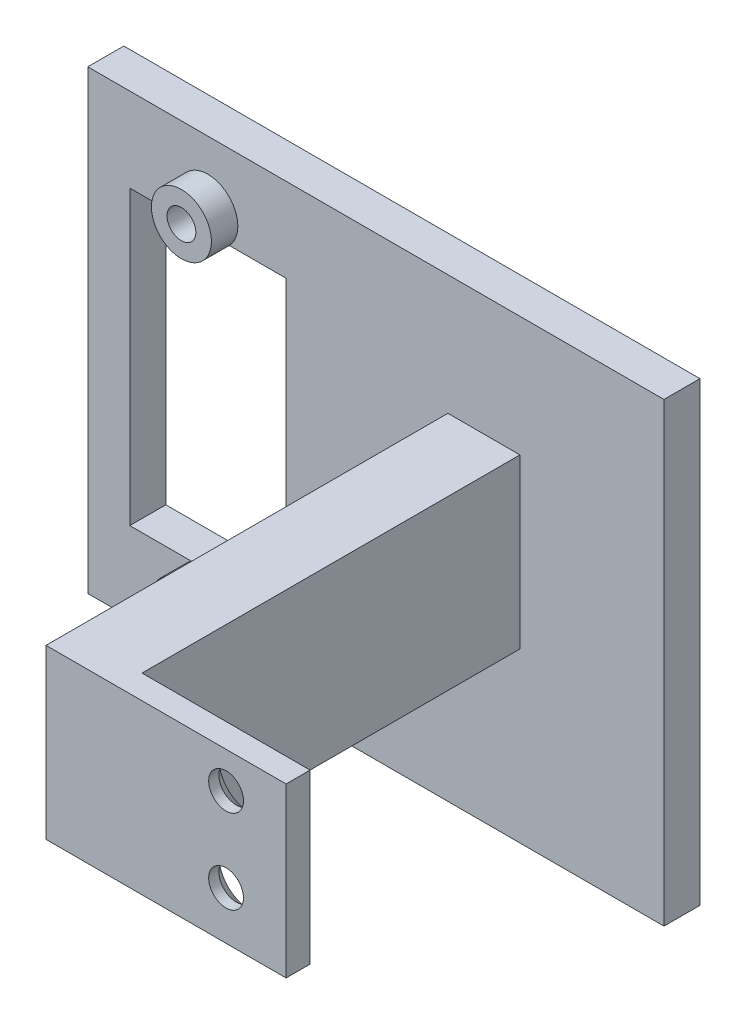
ISO-10303-21;
HEADER;
FILE_DESCRIPTION(('STEP AP214'),'2;1');
FILE_NAME('part.step','',(''),(''),'','','');
FILE_SCHEMA(('AUTOMOTIVE_DESIGN { 1 0 10303 214 1 1 1 1 }'));
ENDSEC;
DATA;
#1=APPLICATION_CONTEXT('core data for automotive mechanical design processes');
#2=APPLICATION_PROTOCOL_DEFINITION('international standard','automotive_design',2000,#1);
#3=PRODUCT_CONTEXT('',#1,'mechanical');
#4=PRODUCT('Part','Part','',(#3));
#5=PRODUCT_RELATED_PRODUCT_CATEGORY('part','',(#4));
#6=PRODUCT_DEFINITION_FORMATION('','',#4);
#7=PRODUCT_DEFINITION_CONTEXT('part definition',#1,'design');
#8=PRODUCT_DEFINITION('design','',#6,#7);
#9=PRODUCT_DEFINITION_SHAPE('','',#8);
#10=(LENGTH_UNIT() NAMED_UNIT(*) SI_UNIT(.MILLI.,.METRE.));
#11=(NAMED_UNIT(*) PLANE_ANGLE_UNIT() SI_UNIT($,.RADIAN.));
#12=(NAMED_UNIT(*) SI_UNIT($,.STERADIAN.) SOLID_ANGLE_UNIT());
#13=UNCERTAINTY_MEASURE_WITH_UNIT(LENGTH_MEASURE(1.E-05),#10,'distance_accuracy_value','');
#14=(GEOMETRIC_REPRESENTATION_CONTEXT(3) GLOBAL_UNCERTAINTY_ASSIGNED_CONTEXT((#13)) GLOBAL_UNIT_ASSIGNED_CONTEXT((#10,
#11,#12)) REPRESENTATION_CONTEXT('',''));
#15=CARTESIAN_POINT('',(0.,0.,0.));
#16=DIRECTION('',(0.,0.,1.));
#17=DIRECTION('',(1.,0.,0.));
#18=AXIS2_PLACEMENT_3D('',#15,#16,#17);
#19=CARTESIAN_POINT('',(-25.,25.,0.01));
#20=DIRECTION('',(0.,0.,-1.));
#21=DIRECTION('',(-1.,0.,0.));
#22=AXIS2_PLACEMENT_3D('',#19,#20,#21);
#23=CYLINDRICAL_SURFACE('',#22,1.45);
#24=CARTESIAN_POINT('',(-25.,25.,0.));
#25=DIRECTION('',(0.,0.,-1.));
#26=DIRECTION('',(-1.,0.,0.));
#27=AXIS2_PLACEMENT_3D('',#24,#25,#26);
#28=CIRCLE('',#27,1.45);
#29=CARTESIAN_POINT('',(-26.45,25.,0.));
#30=VERTEX_POINT('',#29);
#31=EDGE_CURVE('E192',#30,#30,#28,.T.);
#32=ORIENTED_EDGE('',*,*,#31,.F.);
#33=EDGE_LOOP('',(#32));
#34=FACE_BOUND('',#33,.T.);
#35=CARTESIAN_POINT('',(-25.,25.,-0.85));
#36=DIRECTION('',(0.,0.,-1.));
#37=DIRECTION('',(-1.,0.,0.));
#38=AXIS2_PLACEMENT_3D('',#35,#36,#37);
#39=CIRCLE('',#38,1.45);
#40=CARTESIAN_POINT('',(-26.45,25.,-0.85));
#41=VERTEX_POINT('',#40);
#42=EDGE_CURVE('E194',#41,#41,#39,.T.);
#43=ORIENTED_EDGE('',*,*,#42,.T.);
#44=EDGE_LOOP('',(#43));
#45=FACE_BOUND('',#44,.T.);
#46=ADVANCED_FACE('F41',(#34,#45),#23,.F.);
#47=CARTESIAN_POINT('',(-25.,18.,0.01));
#48=DIRECTION('',(0.,0.,-1.));
#49=DIRECTION('',(-1.,0.,0.));
#50=AXIS2_PLACEMENT_3D('',#47,#48,#49);
#51=CYLINDRICAL_SURFACE('',#50,1.45);
#52=CARTESIAN_POINT('',(-25.,18.,0.));
#53=DIRECTION('',(0.,0.,-1.));
#54=DIRECTION('',(-1.,0.,0.));
#55=AXIS2_PLACEMENT_3D('',#52,#53,#54);
#56=CIRCLE('',#55,1.45);
#57=CARTESIAN_POINT('',(-26.45,18.,0.));
#58=VERTEX_POINT('',#57);
#59=EDGE_CURVE('E44',#58,#58,#56,.T.);
#60=ORIENTED_EDGE('',*,*,#59,.F.);
#61=EDGE_LOOP('',(#60));
#62=FACE_BOUND('',#61,.T.);
#63=CARTESIAN_POINT('',(-25.,18.,-0.85));
#64=DIRECTION('',(0.,0.,-1.));
#65=DIRECTION('',(-1.,0.,0.));
#66=AXIS2_PLACEMENT_3D('',#63,#64,#65);
#67=CIRCLE('',#66,1.45);
#68=CARTESIAN_POINT('',(-26.45,18.,-0.85));
#69=VERTEX_POINT('',#68);
#70=EDGE_CURVE('E187',#69,#69,#67,.T.);
#71=ORIENTED_EDGE('',*,*,#70,.T.);
#72=EDGE_LOOP('',(#71));
#73=FACE_BOUND('',#72,.T.);
#74=ADVANCED_FACE('F306',(#62,#73),#51,.F.);
#75=CARTESIAN_POINT('',(0.,0.,-33.480025));
#76=DIRECTION('',(0.,0.,-1.));
#77=DIRECTION('',(-1.,0.,0.));
#78=AXIS2_PLACEMENT_3D('',#75,#76,#77);
#79=PLANE('',#78);
#80=CARTESIAN_POINT('',(-60.,4.55,-33.480025));
#81=DIRECTION('',(0.,0.,1.));
#82=DIRECTION('',(1.,0.,0.));
#83=AXIS2_PLACEMENT_3D('',#80,#81,#82);
#84=CIRCLE('',#83,2.5);
#85=CARTESIAN_POINT('',(-61.3564659966251,6.65,-33.480025));
#86=VERTEX_POINT('',#85);
#87=CARTESIAN_POINT('',(-58.6435340033749,6.65,-33.480025));
#88=VERTEX_POINT('',#87);
#89=EDGE_CURVE('E59',#86,#88,#84,.T.);
#90=ORIENTED_EDGE('',*,*,#89,.F.);
#91=DIRECTION('',(1.,0.,0.));
#92=VECTOR('',#91,1.);
#93=CARTESIAN_POINT('',(-66.5,6.65,-33.480025));
#94=LINE('',#93,#92);
#95=CARTESIAN_POINT('',(-66.5,6.65,-33.480025));
#96=VERTEX_POINT('',#95);
#97=EDGE_CURVE('E236',#96,#86,#94,.T.);
#98=ORIENTED_EDGE('',*,*,#97,.F.);
#99=DIRECTION('',(0.,-1.,0.));
#100=VECTOR('',#99,1.);
#101=CARTESIAN_POINT('',(-66.5,6.65,-33.480025));
#102=LINE('',#101,#100);
#103=CARTESIAN_POINT('',(-66.5,31.,-33.480025));
#104=VERTEX_POINT('',#103);
#105=EDGE_CURVE('E174',#104,#96,#102,.T.);
#106=ORIENTED_EDGE('',*,*,#105,.F.);
#107=DIRECTION('',(-1.,0.,0.));
#108=VECTOR('',#107,1.);
#109=CARTESIAN_POINT('',(-66.5,31.,-33.480025));
#110=LINE('',#109,#108);
#111=CARTESIAN_POINT('',(-61.7853571071357,31.,-33.480025));
#112=VERTEX_POINT('',#111);
#113=EDGE_CURVE('E162',#112,#104,#110,.T.);
#114=ORIENTED_EDGE('',*,*,#113,.F.);
#115=CARTESIAN_POINT('',(-60.,32.75,-33.480025));
#116=DIRECTION('',(0.,0.,1.));
#117=DIRECTION('',(1.,0.,0.));
#118=AXIS2_PLACEMENT_3D('',#115,#116,#117);
#119=CIRCLE('',#118,2.5);
#120=CARTESIAN_POINT('',(-58.2146428928643,31.,-33.480025));
#121=VERTEX_POINT('',#120);
#122=EDGE_CURVE('E65',#121,#112,#119,.T.);
#123=ORIENTED_EDGE('',*,*,#122,.F.);
#124=CARTESIAN_POINT('',(-53.5,31.,-33.480025));
#125=VERTEX_POINT('',#124);
#126=EDGE_CURVE('E163',#125,#121,#110,.T.);
#127=ORIENTED_EDGE('',*,*,#126,.F.);
#128=DIRECTION('',(0.,1.,0.));
#129=VECTOR('',#128,1.);
#130=CARTESIAN_POINT('',(-53.5,6.65,-33.480025));
#131=LINE('',#130,#129);
#132=CARTESIAN_POINT('',(-53.5,6.65,-33.480025));
#133=VERTEX_POINT('',#132);
#134=EDGE_CURVE('E172',#133,#125,#131,.T.);
#135=ORIENTED_EDGE('',*,*,#134,.F.);
#136=EDGE_CURVE('E234',#88,#133,#94,.T.);
#137=ORIENTED_EDGE('',*,*,#136,.F.);
#138=EDGE_LOOP('',(#90,#98,#106,#114,#123,#127,#135,#137));
#139=FACE_BOUND('',#138,.T.);
#140=DIRECTION('',(0.,-1.,0.));
#141=VECTOR('',#140,1.);
#142=CARTESIAN_POINT('',(-70.,0.,-33.480025));
#143=LINE('',#142,#141);
#144=CARTESIAN_POINT('',(-70.,38.,-33.480025));
#145=VERTEX_POINT('',#144);
#146=CARTESIAN_POINT('',(-70.,0.,-33.480025));
#147=VERTEX_POINT('',#146);
#148=EDGE_CURVE('E263',#145,#147,#143,.T.);
#149=ORIENTED_EDGE('',*,*,#148,.T.);
#150=DIRECTION('',(1.,0.,0.));
#151=VECTOR('',#150,1.);
#152=CARTESIAN_POINT('',(-70.,0.,-33.480025));
#153=LINE('',#152,#151);
#154=CARTESIAN_POINT('',(-22.,0.,-33.480025));
#155=VERTEX_POINT('',#154);
#156=EDGE_CURVE('E264',#147,#155,#153,.T.);
#157=ORIENTED_EDGE('',*,*,#156,.T.);
#158=DIRECTION('',(0.,1.,0.));
#159=VECTOR('',#158,1.);
#160=CARTESIAN_POINT('',(-22.,0.,-33.480025));
#161=LINE('',#160,#159);
#162=CARTESIAN_POINT('',(-22.,38.,-33.480025));
#163=VERTEX_POINT('',#162);
#164=EDGE_CURVE('E270',#155,#163,#161,.T.);
#165=ORIENTED_EDGE('',*,*,#164,.T.);
#166=DIRECTION('',(-1.,0.,0.));
#167=VECTOR('',#166,1.);
#168=CARTESIAN_POINT('',(-70.,38.,-33.480025));
#169=LINE('',#168,#167);
#170=EDGE_CURVE('E267',#163,#145,#169,.T.);
#171=ORIENTED_EDGE('',*,*,#170,.T.);
#172=EDGE_LOOP('',(#149,#157,#165,#171));
#173=FACE_BOUND('',#172,.T.);
#174=DIRECTION('',(0.,-1.,0.));
#175=VECTOR('',#174,1.);
#176=CARTESIAN_POINT('',(-40.,0.,-33.480025));
#177=LINE('',#176,#175);
#178=CARTESIAN_POINT('',(-40.,28.,-33.480025));
#179=VERTEX_POINT('',#178);
#180=CARTESIAN_POINT('',(-40.,14.,-33.480025));
#181=VERTEX_POINT('',#180);
#182=EDGE_CURVE('E49',#179,#181,#177,.T.);
#183=ORIENTED_EDGE('',*,*,#182,.F.);
#184=DIRECTION('',(-1.,0.,0.));
#185=VECTOR('',#184,1.);
#186=CARTESIAN_POINT('',(0.,28.,-33.480025));
#187=LINE('',#186,#185);
#188=CARTESIAN_POINT('',(-34.,28.,-33.480025));
#189=VERTEX_POINT('',#188);
#190=EDGE_CURVE('E290',#189,#179,#187,.T.);
#191=ORIENTED_EDGE('',*,*,#190,.F.);
#192=DIRECTION('',(0.,1.,0.));
#193=VECTOR('',#192,1.);
#194=CARTESIAN_POINT('',(-34.,0.,-33.480025));
#195=LINE('',#194,#193);
#196=CARTESIAN_POINT('',(-34.,14.,-33.480025));
#197=VERTEX_POINT('',#196);
#198=EDGE_CURVE('E295',#197,#189,#195,.T.);
#199=ORIENTED_EDGE('',*,*,#198,.F.);
#200=DIRECTION('',(1.,0.,0.));
#201=VECTOR('',#200,1.);
#202=CARTESIAN_POINT('',(0.,14.,-33.480025));
#203=LINE('',#202,#201);
#204=EDGE_CURVE('E298',#181,#197,#203,.T.);
#205=ORIENTED_EDGE('',*,*,#204,.F.);
#206=EDGE_LOOP('',(#183,#191,#199,#205));
#207=FACE_BOUND('',#206,.T.);
#208=ADVANCED_FACE('F167',(#139,#173,#207),#79,.F.);
#209=CARTESIAN_POINT('',(0.,0.,-36.480025));
#210=DIRECTION('',(0.,0.,-1.));
#211=DIRECTION('',(-1.,0.,0.));
#212=AXIS2_PLACEMENT_3D('',#209,#210,#211);
#213=PLANE('',#212);
#214=CARTESIAN_POINT('',(-60.,4.55,-36.480025));
#215=DIRECTION('',(0.,0.,-1.));
#216=DIRECTION('',(-1.,0.,0.));
#217=AXIS2_PLACEMENT_3D('',#214,#215,#216);
#218=CIRCLE('',#217,1.2);
#219=CARTESIAN_POINT('',(-61.2,4.55,-36.480025));
#220=VERTEX_POINT('',#219);
#221=EDGE_CURVE('E404',#220,#220,#218,.T.);
#222=ORIENTED_EDGE('',*,*,#221,.F.);
#223=EDGE_LOOP('',(#222));
#224=FACE_BOUND('',#223,.T.);
#225=CARTESIAN_POINT('',(-60.,32.75,-36.480025));
#226=DIRECTION('',(0.,0.,-1.));
#227=DIRECTION('',(-1.,0.,0.));
#228=AXIS2_PLACEMENT_3D('',#225,#226,#227);
#229=CIRCLE('',#228,1.2);
#230=CARTESIAN_POINT('',(-61.2,32.75,-36.480025));
#231=VERTEX_POINT('',#230);
#232=EDGE_CURVE('E188',#231,#231,#229,.T.);
#233=ORIENTED_EDGE('',*,*,#232,.F.);
#234=EDGE_LOOP('',(#233));
#235=FACE_BOUND('',#234,.T.);
#236=DIRECTION('',(0.,-1.,0.));
#237=VECTOR('',#236,1.);
#238=CARTESIAN_POINT('',(-70.,0.,-36.480025));
#239=LINE('',#238,#237);
#240=CARTESIAN_POINT('',(-70.,38.,-36.480025));
#241=VERTEX_POINT('',#240);
#242=CARTESIAN_POINT('',(-70.,0.,-36.480025));
#243=VERTEX_POINT('',#242);
#244=EDGE_CURVE('E259',#241,#243,#239,.T.);
#245=ORIENTED_EDGE('',*,*,#244,.F.);
#246=DIRECTION('',(-1.,0.,0.));
#247=VECTOR('',#246,1.);
#248=CARTESIAN_POINT('',(-70.,38.,-36.480025));
#249=LINE('',#248,#247);
#250=CARTESIAN_POINT('',(-22.,38.,-36.480025));
#251=VERTEX_POINT('',#250);
#252=EDGE_CURVE('E262',#251,#241,#249,.T.);
#253=ORIENTED_EDGE('',*,*,#252,.F.);
#254=DIRECTION('',(0.,1.,0.));
#255=VECTOR('',#254,1.);
#256=CARTESIAN_POINT('',(-22.,0.,-36.480025));
#257=LINE('',#256,#255);
#258=CARTESIAN_POINT('',(-22.,0.,-36.480025));
#259=VERTEX_POINT('',#258);
#260=EDGE_CURVE('E276',#259,#251,#257,.T.);
#261=ORIENTED_EDGE('',*,*,#260,.F.);
#262=DIRECTION('',(1.,0.,0.));
#263=VECTOR('',#262,1.);
#264=CARTESIAN_POINT('',(-70.,0.,-36.480025));
#265=LINE('',#264,#263);
#266=EDGE_CURVE('E272',#243,#259,#265,.T.);
#267=ORIENTED_EDGE('',*,*,#266,.F.);
#268=EDGE_LOOP('',(#245,#253,#261,#267));
#269=FACE_BOUND('',#268,.T.);
#270=DIRECTION('',(-1.,0.,0.));
#271=VECTOR('',#270,1.);
#272=CARTESIAN_POINT('',(-66.5,31.,-36.480025));
#273=LINE('',#272,#271);
#274=CARTESIAN_POINT('',(-53.5,31.,-36.480025));
#275=VERTEX_POINT('',#274);
#276=CARTESIAN_POINT('',(-66.5,31.,-36.480025));
#277=VERTEX_POINT('',#276);
#278=EDGE_CURVE('E233',#275,#277,#273,.T.);
#279=ORIENTED_EDGE('',*,*,#278,.T.);
#280=DIRECTION('',(0.,-1.,0.));
#281=VECTOR('',#280,1.);
#282=CARTESIAN_POINT('',(-66.5,6.65,-36.480025));
#283=LINE('',#282,#281);
#284=CARTESIAN_POINT('',(-66.5,6.65,-36.480025));
#285=VERTEX_POINT('',#284);
#286=EDGE_CURVE('E235',#277,#285,#283,.T.);
#287=ORIENTED_EDGE('',*,*,#286,.T.);
#288=DIRECTION('',(1.,0.,0.));
#289=VECTOR('',#288,1.);
#290=CARTESIAN_POINT('',(-66.5,6.65,-36.480025));
#291=LINE('',#290,#289);
#292=CARTESIAN_POINT('',(-53.5,6.65,-36.480025));
#293=VERTEX_POINT('',#292);
#294=EDGE_CURVE('E243',#285,#293,#291,.T.);
#295=ORIENTED_EDGE('',*,*,#294,.T.);
#296=DIRECTION('',(0.,1.,0.));
#297=VECTOR('',#296,1.);
#298=CARTESIAN_POINT('',(-53.5,6.65,-36.480025));
#299=LINE('',#298,#297);
#300=EDGE_CURVE('E249',#293,#275,#299,.T.);
#301=ORIENTED_EDGE('',*,*,#300,.T.);
#302=EDGE_LOOP('',(#279,#287,#295,#301));
#303=FACE_BOUND('',#302,.T.);
#304=ADVANCED_FACE('F429',(#224,#235,#269,#303),#213,.T.);
#305=CARTESIAN_POINT('',(-70.,0.,-33.480025));
#306=DIRECTION('',(1.,0.,0.));
#307=DIRECTION('',(0.,0.,-1.));
#308=AXIS2_PLACEMENT_3D('',#305,#306,#307);
#309=PLANE('',#308);
#310=ORIENTED_EDGE('',*,*,#244,.T.);
#311=DIRECTION('',(0.,0.,-1.));
#312=VECTOR('',#311,1.);
#313=CARTESIAN_POINT('',(-70.,0.,-33.480025));
#314=LINE('',#313,#312);
#315=EDGE_CURVE('E287',#147,#243,#314,.T.);
#316=ORIENTED_EDGE('',*,*,#315,.F.);
#317=ORIENTED_EDGE('',*,*,#148,.F.);
#318=DIRECTION('',(0.,0.,-1.));
#319=VECTOR('',#318,1.);
#320=CARTESIAN_POINT('',(-70.,38.,-33.480025));
#321=LINE('',#320,#319);
#322=EDGE_CURVE('E271',#145,#241,#321,.T.);
#323=ORIENTED_EDGE('',*,*,#322,.T.);
#324=EDGE_LOOP('',(#310,#316,#317,#323));
#325=FACE_BOUND('',#324,.T.);
#326=ADVANCED_FACE('F43',(#325),#309,.F.);
#327=CARTESIAN_POINT('',(-70.,0.,-33.480025));
#328=DIRECTION('',(0.,1.,0.));
#329=DIRECTION('',(0.,0.,1.));
#330=AXIS2_PLACEMENT_3D('',#327,#328,#329);
#331=PLANE('',#330);
#332=ORIENTED_EDGE('',*,*,#266,.T.);
#333=DIRECTION('',(0.,0.,-1.));
#334=VECTOR('',#333,1.);
#335=CARTESIAN_POINT('',(-22.,0.,-33.480025));
#336=LINE('',#335,#334);
#337=EDGE_CURVE('E281',#155,#259,#336,.T.);
#338=ORIENTED_EDGE('',*,*,#337,.F.);
#339=ORIENTED_EDGE('',*,*,#156,.F.);
#340=ORIENTED_EDGE('',*,*,#315,.T.);
#341=EDGE_LOOP('',(#332,#338,#339,#340));
#342=FACE_BOUND('',#341,.T.);
#343=ADVANCED_FACE('F454',(#342),#331,.F.);
#344=CARTESIAN_POINT('',(-22.,0.,-33.480025));
#345=DIRECTION('',(-1.,0.,0.));
#346=DIRECTION('',(0.,0.,1.));
#347=AXIS2_PLACEMENT_3D('',#344,#345,#346);
#348=PLANE('',#347);
#349=ORIENTED_EDGE('',*,*,#260,.T.);
#350=DIRECTION('',(0.,0.,-1.));
#351=VECTOR('',#350,1.);
#352=CARTESIAN_POINT('',(-22.,38.,-33.480025));
#353=LINE('',#352,#351);
#354=EDGE_CURVE('E282',#163,#251,#353,.T.);
#355=ORIENTED_EDGE('',*,*,#354,.F.);
#356=ORIENTED_EDGE('',*,*,#164,.F.);
#357=ORIENTED_EDGE('',*,*,#337,.T.);
#358=EDGE_LOOP('',(#349,#355,#356,#357));
#359=FACE_BOUND('',#358,.T.);
#360=ADVANCED_FACE('F445',(#359),#348,.F.);
#361=CARTESIAN_POINT('',(-70.,38.,-33.480025));
#362=DIRECTION('',(0.,-1.,0.));
#363=DIRECTION('',(0.,0.,-1.));
#364=AXIS2_PLACEMENT_3D('',#361,#362,#363);
#365=PLANE('',#364);
#366=ORIENTED_EDGE('',*,*,#252,.T.);
#367=ORIENTED_EDGE('',*,*,#322,.F.);
#368=ORIENTED_EDGE('',*,*,#170,.F.);
#369=ORIENTED_EDGE('',*,*,#354,.T.);
#370=EDGE_LOOP('',(#366,#367,#368,#369));
#371=FACE_BOUND('',#370,.T.);
#372=ADVANCED_FACE('F433',(#371),#365,.F.);
#373=CARTESIAN_POINT('',(-66.5,6.65,-33.480025));
#374=DIRECTION('',(1.,0.,0.));
#375=DIRECTION('',(0.,0.,-1.));
#376=AXIS2_PLACEMENT_3D('',#373,#374,#375);
#377=PLANE('',#376);
#378=ORIENTED_EDGE('',*,*,#286,.F.);
#379=DIRECTION('',(0.,0.,-1.));
#380=VECTOR('',#379,1.);
#381=CARTESIAN_POINT('',(-66.5,31.,-33.480025));
#382=LINE('',#381,#380);
#383=EDGE_CURVE('E244',#104,#277,#382,.T.);
#384=ORIENTED_EDGE('',*,*,#383,.F.);
#385=ORIENTED_EDGE('',*,*,#105,.T.);
#386=DIRECTION('',(0.,0.,-1.));
#387=VECTOR('',#386,1.);
#388=CARTESIAN_POINT('',(-66.5,6.65,-33.480025));
#389=LINE('',#388,#387);
#390=EDGE_CURVE('E257',#96,#285,#389,.T.);
#391=ORIENTED_EDGE('',*,*,#390,.T.);
#392=EDGE_LOOP('',(#378,#384,#385,#391));
#393=FACE_BOUND('',#392,.T.);
#394=ADVANCED_FACE('F434',(#393),#377,.T.);
#395=CARTESIAN_POINT('',(-66.5,6.65,-33.480025));
#396=DIRECTION('',(0.,1.,0.));
#397=DIRECTION('',(0.,0.,1.));
#398=AXIS2_PLACEMENT_3D('',#395,#396,#397);
#399=PLANE('',#398);
#400=ORIENTED_EDGE('',*,*,#294,.F.);
#401=ORIENTED_EDGE('',*,*,#390,.F.);
#402=ORIENTED_EDGE('',*,*,#97,.T.);
#403=EDGE_CURVE('E239',#86,#88,#94,.T.);
#404=ORIENTED_EDGE('',*,*,#403,.T.);
#405=ORIENTED_EDGE('',*,*,#136,.T.);
#406=DIRECTION('',(0.,0.,-1.));
#407=VECTOR('',#406,1.);
#408=CARTESIAN_POINT('',(-53.5,6.65,-33.480025));
#409=LINE('',#408,#407);
#410=EDGE_CURVE('E251',#133,#293,#409,.T.);
#411=ORIENTED_EDGE('',*,*,#410,.T.);
#412=EDGE_LOOP('',(#400,#401,#402,#404,#405,#411));
#413=FACE_BOUND('',#412,.T.);
#414=ADVANCED_FACE('F422',(#413),#399,.T.);
#415=CARTESIAN_POINT('',(-53.5,6.65,-33.480025));
#416=DIRECTION('',(-1.,0.,0.));
#417=DIRECTION('',(0.,0.,1.));
#418=AXIS2_PLACEMENT_3D('',#415,#416,#417);
#419=PLANE('',#418);
#420=ORIENTED_EDGE('',*,*,#300,.F.);
#421=ORIENTED_EDGE('',*,*,#410,.F.);
#422=ORIENTED_EDGE('',*,*,#134,.T.);
#423=DIRECTION('',(0.,0.,-1.));
#424=VECTOR('',#423,1.);
#425=CARTESIAN_POINT('',(-53.5,31.,-33.480025));
#426=LINE('',#425,#424);
#427=EDGE_CURVE('E253',#125,#275,#426,.T.);
#428=ORIENTED_EDGE('',*,*,#427,.T.);
#429=EDGE_LOOP('',(#420,#421,#422,#428));
#430=FACE_BOUND('',#429,.T.);
#431=ADVANCED_FACE('F427',(#430),#419,.T.);
#432=CARTESIAN_POINT('',(-66.5,31.,-33.480025));
#433=DIRECTION('',(0.,-1.,0.));
#434=DIRECTION('',(0.,0.,-1.));
#435=AXIS2_PLACEMENT_3D('',#432,#433,#434);
#436=PLANE('',#435);
#437=ORIENTED_EDGE('',*,*,#278,.F.);
#438=ORIENTED_EDGE('',*,*,#427,.F.);
#439=ORIENTED_EDGE('',*,*,#126,.T.);
#440=EDGE_CURVE('E156',#121,#112,#110,.T.);
#441=ORIENTED_EDGE('',*,*,#440,.T.);
#442=ORIENTED_EDGE('',*,*,#113,.T.);
#443=ORIENTED_EDGE('',*,*,#383,.T.);
#444=EDGE_LOOP('',(#437,#438,#439,#441,#442,#443));
#445=FACE_BOUND('',#444,.T.);
#446=ADVANCED_FACE('F158',(#445),#436,.T.);
#447=CARTESIAN_POINT('',(-40.,14.,-1.));
#448=DIRECTION('',(1.,0.,0.));
#449=DIRECTION('',(0.,0.,-1.));
#450=AXIS2_PLACEMENT_3D('',#447,#448,#449);
#451=PLANE('',#450);
#452=DIRECTION('',(0.,0.,-1.));
#453=VECTOR('',#452,1.);
#454=CARTESIAN_POINT('',(-40.,28.,-1.));
#455=LINE('',#454,#453);
#456=CARTESIAN_POINT('',(-40.,28.,0.));
#457=VERTEX_POINT('',#456);
#458=EDGE_CURVE('E225',#457,#179,#455,.T.);
#459=ORIENTED_EDGE('',*,*,#458,.T.);
#460=ORIENTED_EDGE('',*,*,#182,.T.);
#461=DIRECTION('',(0.,0.,-1.));
#462=VECTOR('',#461,1.);
#463=CARTESIAN_POINT('',(-40.,14.,-1.));
#464=LINE('',#463,#462);
#465=CARTESIAN_POINT('',(-40.,14.,0.));
#466=VERTEX_POINT('',#465);
#467=EDGE_CURVE('E226',#466,#181,#464,.T.);
#468=ORIENTED_EDGE('',*,*,#467,.F.);
#469=DIRECTION('',(0.,-1.,0.));
#470=VECTOR('',#469,1.);
#471=CARTESIAN_POINT('',(-40.,14.,0.));
#472=LINE('',#471,#470);
#473=EDGE_CURVE('E201',#457,#466,#472,.T.);
#474=ORIENTED_EDGE('',*,*,#473,.F.);
#475=EDGE_LOOP('',(#459,#460,#468,#474));
#476=FACE_BOUND('',#475,.T.);
#477=ADVANCED_FACE('F347',(#476),#451,.F.);
#478=CARTESIAN_POINT('',(-40.,14.,-1.));
#479=DIRECTION('',(0.,1.,0.));
#480=DIRECTION('',(0.,0.,1.));
#481=AXIS2_PLACEMENT_3D('',#478,#479,#480);
#482=PLANE('',#481);
#483=DIRECTION('',(0.,0.,-1.));
#484=VECTOR('',#483,1.);
#485=CARTESIAN_POINT('',(-34.,14.,-1.));
#486=LINE('',#485,#484);
#487=CARTESIAN_POINT('',(-34.,14.,-2.));
#488=VERTEX_POINT('',#487);
#489=EDGE_CURVE('E228',#488,#197,#486,.T.);
#490=ORIENTED_EDGE('',*,*,#489,.F.);
#491=DIRECTION('',(1.,0.,0.));
#492=VECTOR('',#491,1.);
#493=CARTESIAN_POINT('',(-40.,14.,-2.));
#494=LINE('',#493,#492);
#495=CARTESIAN_POINT('',(-20.,14.,-2.));
#496=VERTEX_POINT('',#495);
#497=EDGE_CURVE('E214',#488,#496,#494,.T.);
#498=ORIENTED_EDGE('',*,*,#497,.T.);
#499=DIRECTION('',(0.,0.,-1.));
#500=VECTOR('',#499,1.);
#501=CARTESIAN_POINT('',(-20.,14.,0.));
#502=LINE('',#501,#500);
#503=CARTESIAN_POINT('',(-20.,14.,0.));
#504=VERTEX_POINT('',#503);
#505=EDGE_CURVE('E223',#504,#496,#502,.T.);
#506=ORIENTED_EDGE('',*,*,#505,.F.);
#507=DIRECTION('',(1.,0.,0.));
#508=VECTOR('',#507,1.);
#509=CARTESIAN_POINT('',(-40.,14.,0.));
#510=LINE('',#509,#508);
#511=EDGE_CURVE('E203',#466,#504,#510,.T.);
#512=ORIENTED_EDGE('',*,*,#511,.F.);
#513=ORIENTED_EDGE('',*,*,#467,.T.);
#514=ORIENTED_EDGE('',*,*,#204,.T.);
#515=EDGE_LOOP('',(#490,#498,#506,#512,#513,#514));
#516=FACE_BOUND('',#515,.T.);
#517=ADVANCED_FACE('F342',(#516),#482,.F.);
#518=CARTESIAN_POINT('',(-34.,14.,-1.));
#519=DIRECTION('',(-1.,0.,0.));
#520=DIRECTION('',(0.,0.,1.));
#521=AXIS2_PLACEMENT_3D('',#518,#519,#520);
#522=PLANE('',#521);
#523=DIRECTION('',(0.,0.,-1.));
#524=VECTOR('',#523,1.);
#525=CARTESIAN_POINT('',(-34.,28.,-1.));
#526=LINE('',#525,#524);
#527=CARTESIAN_POINT('',(-34.,28.,-2.));
#528=VERTEX_POINT('',#527);
#529=EDGE_CURVE('E227',#528,#189,#526,.T.);
#530=ORIENTED_EDGE('',*,*,#529,.F.);
#531=DIRECTION('',(0.,-1.,0.));
#532=VECTOR('',#531,1.);
#533=CARTESIAN_POINT('',(-34.,14.,-2.));
#534=LINE('',#533,#532);
#535=EDGE_CURVE('E11',#528,#488,#534,.T.);
#536=ORIENTED_EDGE('',*,*,#535,.T.);
#537=ORIENTED_EDGE('',*,*,#489,.T.);
#538=ORIENTED_EDGE('',*,*,#198,.T.);
#539=EDGE_LOOP('',(#530,#536,#537,#538));
#540=FACE_BOUND('',#539,.T.);
#541=ADVANCED_FACE('F336',(#540),#522,.F.);
#542=CARTESIAN_POINT('',(-40.,28.,-1.));
#543=DIRECTION('',(0.,-1.,0.));
#544=DIRECTION('',(0.,0.,-1.));
#545=AXIS2_PLACEMENT_3D('',#542,#543,#544);
#546=PLANE('',#545);
#547=DIRECTION('',(-1.,0.,0.));
#548=VECTOR('',#547,1.);
#549=CARTESIAN_POINT('',(-40.,28.,-2.));
#550=LINE('',#549,#548);
#551=CARTESIAN_POINT('',(-20.,28.,-2.));
#552=VERTEX_POINT('',#551);
#553=EDGE_CURVE('E204',#552,#528,#550,.T.);
#554=ORIENTED_EDGE('',*,*,#553,.T.);
#555=ORIENTED_EDGE('',*,*,#529,.T.);
#556=ORIENTED_EDGE('',*,*,#190,.T.);
#557=ORIENTED_EDGE('',*,*,#458,.F.);
#558=DIRECTION('',(-1.,0.,0.));
#559=VECTOR('',#558,1.);
#560=CARTESIAN_POINT('',(-40.,28.,0.));
#561=LINE('',#560,#559);
#562=CARTESIAN_POINT('',(-20.,28.,0.));
#563=VERTEX_POINT('',#562);
#564=EDGE_CURVE('E206',#563,#457,#561,.T.);
#565=ORIENTED_EDGE('',*,*,#564,.F.);
#566=DIRECTION('',(0.,0.,-1.));
#567=VECTOR('',#566,1.);
#568=CARTESIAN_POINT('',(-20.,28.,0.));
#569=LINE('',#568,#567);
#570=EDGE_CURVE('E212',#563,#552,#569,.T.);
#571=ORIENTED_EDGE('',*,*,#570,.T.);
#572=EDGE_LOOP('',(#554,#555,#556,#557,#565,#571));
#573=FACE_BOUND('',#572,.T.);
#574=ADVANCED_FACE('F321',(#573),#546,.F.);
#575=CARTESIAN_POINT('',(0.,0.,-2.));
#576=DIRECTION('',(0.,0.,-1.));
#577=DIRECTION('',(-1.,0.,0.));
#578=AXIS2_PLACEMENT_3D('',#575,#576,#577);
#579=PLANE('',#578);
#580=CARTESIAN_POINT('',(-25.,18.,-2.));
#581=DIRECTION('',(0.,0.,-1.));
#582=DIRECTION('',(-1.,0.,0.));
#583=AXIS2_PLACEMENT_3D('',#580,#581,#582);
#584=CIRCLE('',#583,2.6);
#585=CARTESIAN_POINT('',(-27.6,18.,-2.));
#586=VERTEX_POINT('',#585);
#587=EDGE_CURVE('E190',#586,#586,#584,.T.);
#588=ORIENTED_EDGE('',*,*,#587,.F.);
#589=EDGE_LOOP('',(#588));
#590=FACE_BOUND('',#589,.T.);
#591=CARTESIAN_POINT('',(-25.,25.,-2.));
#592=DIRECTION('',(0.,0.,-1.));
#593=DIRECTION('',(-1.,0.,0.));
#594=AXIS2_PLACEMENT_3D('',#591,#592,#593);
#595=CIRCLE('',#594,2.6);
#596=CARTESIAN_POINT('',(-27.6,25.,-2.));
#597=VERTEX_POINT('',#596);
#598=EDGE_CURVE('E191',#597,#597,#595,.T.);
#599=ORIENTED_EDGE('',*,*,#598,.F.);
#600=EDGE_LOOP('',(#599));
#601=FACE_BOUND('',#600,.T.);
#602=ORIENTED_EDGE('',*,*,#535,.F.);
#603=ORIENTED_EDGE('',*,*,#553,.F.);
#604=DIRECTION('',(0.,1.,0.));
#605=VECTOR('',#604,1.);
#606=CARTESIAN_POINT('',(-20.,14.,-2.));
#607=LINE('',#606,#605);
#608=EDGE_CURVE('E215',#496,#552,#607,.T.);
#609=ORIENTED_EDGE('',*,*,#608,.F.);
#610=ORIENTED_EDGE('',*,*,#497,.F.);
#611=EDGE_LOOP('',(#602,#603,#609,#610));
#612=FACE_BOUND('',#611,.T.);
#613=ADVANCED_FACE('F323',(#590,#601,#612),#579,.T.);
#614=CARTESIAN_POINT('',(-20.,14.,0.));
#615=DIRECTION('',(-1.,0.,0.));
#616=DIRECTION('',(0.,0.,1.));
#617=AXIS2_PLACEMENT_3D('',#614,#615,#616);
#618=PLANE('',#617);
#619=ORIENTED_EDGE('',*,*,#608,.T.);
#620=ORIENTED_EDGE('',*,*,#570,.F.);
#621=DIRECTION('',(0.,1.,0.));
#622=VECTOR('',#621,1.);
#623=CARTESIAN_POINT('',(-20.,14.,0.));
#624=LINE('',#623,#622);
#625=EDGE_CURVE('E210',#504,#563,#624,.T.);
#626=ORIENTED_EDGE('',*,*,#625,.F.);
#627=ORIENTED_EDGE('',*,*,#505,.T.);
#628=EDGE_LOOP('',(#619,#620,#626,#627));
#629=FACE_BOUND('',#628,.T.);
#630=ADVANCED_FACE('F325',(#629),#618,.F.);
#631=CARTESIAN_POINT('',(0.,0.,0.));
#632=DIRECTION('',(0.,0.,-1.));
#633=DIRECTION('',(-1.,0.,0.));
#634=AXIS2_PLACEMENT_3D('',#631,#632,#633);
#635=PLANE('',#634);
#636=ORIENTED_EDGE('',*,*,#59,.T.);
#637=EDGE_LOOP('',(#636));
#638=FACE_BOUND('',#637,.T.);
#639=ORIENTED_EDGE('',*,*,#31,.T.);
#640=EDGE_LOOP('',(#639));
#641=FACE_BOUND('',#640,.T.);
#642=ORIENTED_EDGE('',*,*,#473,.T.);
#643=ORIENTED_EDGE('',*,*,#511,.T.);
#644=ORIENTED_EDGE('',*,*,#625,.T.);
#645=ORIENTED_EDGE('',*,*,#564,.T.);
#646=EDGE_LOOP('',(#642,#643,#644,#645));
#647=FACE_BOUND('',#646,.T.);
#648=ADVANCED_FACE('F307',(#638,#641,#647),#635,.F.);
#649=CARTESIAN_POINT('',(-25.,18.,-2.));
#650=DIRECTION('',(0.,0.,-1.));
#651=DIRECTION('',(-1.,0.,0.));
#652=AXIS2_PLACEMENT_3D('',#649,#650,#651);
#653=CONICAL_SURFACE('',#652,2.6,0.785398163397448);
#654=ORIENTED_EDGE('',*,*,#70,.F.);
#655=EDGE_LOOP('',(#654));
#656=FACE_BOUND('',#655,.T.);
#657=ORIENTED_EDGE('',*,*,#587,.T.);
#658=EDGE_LOOP('',(#657));
#659=FACE_BOUND('',#658,.T.);
#660=ADVANCED_FACE('F313',(#656,#659),#653,.F.);
#661=CARTESIAN_POINT('',(-25.,25.,-2.));
#662=DIRECTION('',(0.,0.,-1.));
#663=DIRECTION('',(-1.,0.,0.));
#664=AXIS2_PLACEMENT_3D('',#661,#662,#663);
#665=CONICAL_SURFACE('',#664,2.6,0.785398163397448);
#666=ORIENTED_EDGE('',*,*,#42,.F.);
#667=EDGE_LOOP('',(#666));
#668=FACE_BOUND('',#667,.T.);
#669=ORIENTED_EDGE('',*,*,#598,.T.);
#670=EDGE_LOOP('',(#669));
#671=FACE_BOUND('',#670,.T.);
#672=ADVANCED_FACE('F316',(#668,#671),#665,.F.);
#673=CARTESIAN_POINT('',(-60.,32.75,-31.280025));
#674=DIRECTION('',(0.,0.,-1.));
#675=DIRECTION('',(-1.,0.,0.));
#676=AXIS2_PLACEMENT_3D('',#673,#674,#675);
#677=CYLINDRICAL_SURFACE('',#676,2.5);
#678=CARTESIAN_POINT('',(-60.,32.75,-31.280025));
#679=DIRECTION('',(0.,0.,1.));
#680=DIRECTION('',(1.,0.,0.));
#681=AXIS2_PLACEMENT_3D('',#678,#679,#680);
#682=CIRCLE('',#681,2.5);
#683=CARTESIAN_POINT('',(-57.5,32.75,-31.280025));
#684=VERTEX_POINT('',#683);
#685=EDGE_CURVE('E180',#684,#684,#682,.T.);
#686=ORIENTED_EDGE('',*,*,#685,.F.);
#687=EDGE_LOOP('',(#686));
#688=FACE_BOUND('',#687,.T.);
#689=EDGE_CURVE('E177',#112,#121,#119,.T.);
#690=ORIENTED_EDGE('',*,*,#689,.T.);
#691=ORIENTED_EDGE('',*,*,#122,.T.);
#692=EDGE_LOOP('',(#690,#691));
#693=FACE_BOUND('',#692,.T.);
#694=ADVANCED_FACE('F171',(#688,#693),#677,.T.);
#695=CARTESIAN_POINT('',(-60.,32.75,-31.280025));
#696=DIRECTION('',(0.,0.,1.));
#697=DIRECTION('',(1.,0.,0.));
#698=AXIS2_PLACEMENT_3D('',#695,#696,#697);
#699=PLANE('',#698);
#700=CARTESIAN_POINT('',(-60.,32.75,-31.280025));
#701=DIRECTION('',(0.,0.,1.));
#702=DIRECTION('',(1.,0.,0.));
#703=AXIS2_PLACEMENT_3D('',#700,#701,#702);
#704=CIRCLE('',#703,1.2);
#705=CARTESIAN_POINT('',(-58.8,32.75,-31.280025));
#706=VERTEX_POINT('',#705);
#707=EDGE_CURVE('E406',#706,#706,#704,.T.);
#708=ORIENTED_EDGE('',*,*,#707,.F.);
#709=EDGE_LOOP('',(#708));
#710=FACE_BOUND('',#709,.T.);
#711=ORIENTED_EDGE('',*,*,#685,.T.);
#712=EDGE_LOOP('',(#711));
#713=FACE_BOUND('',#712,.T.);
#714=ADVANCED_FACE('F373',(#710,#713),#699,.T.);
#715=CARTESIAN_POINT('',(-60.,32.75,-33.480025));
#716=DIRECTION('',(0.,0.,1.));
#717=DIRECTION('',(1.,0.,0.));
#718=AXIS2_PLACEMENT_3D('',#715,#716,#717);
#719=PLANE('',#718);
#720=ORIENTED_EDGE('',*,*,#440,.F.);
#721=ORIENTED_EDGE('',*,*,#689,.F.);
#722=EDGE_LOOP('',(#720,#721));
#723=FACE_BOUND('',#722,.T.);
#724=ADVANCED_FACE('F179',(#723),#719,.F.);
#725=CARTESIAN_POINT('',(-60.,4.55,-31.280025));
#726=DIRECTION('',(0.,0.,-1.));
#727=DIRECTION('',(-1.,0.,0.));
#728=AXIS2_PLACEMENT_3D('',#725,#726,#727);
#729=CYLINDRICAL_SURFACE('',#728,2.5);
#730=CARTESIAN_POINT('',(-60.,4.55,-31.280025));
#731=DIRECTION('',(0.,0.,1.));
#732=DIRECTION('',(1.,0.,0.));
#733=AXIS2_PLACEMENT_3D('',#730,#731,#732);
#734=CIRCLE('',#733,2.5);
#735=CARTESIAN_POINT('',(-57.5,4.55,-31.280025));
#736=VERTEX_POINT('',#735);
#737=EDGE_CURVE('E198',#736,#736,#734,.T.);
#738=ORIENTED_EDGE('',*,*,#737,.F.);
#739=EDGE_LOOP('',(#738));
#740=FACE_BOUND('',#739,.T.);
#741=EDGE_CURVE('E176',#88,#86,#84,.T.);
#742=ORIENTED_EDGE('',*,*,#741,.T.);
#743=ORIENTED_EDGE('',*,*,#89,.T.);
#744=EDGE_LOOP('',(#742,#743));
#745=FACE_BOUND('',#744,.T.);
#746=ADVANCED_FACE('F380',(#740,#745),#729,.T.);
#747=CARTESIAN_POINT('',(-60.,4.55,-31.280025));
#748=DIRECTION('',(0.,0.,1.));
#749=DIRECTION('',(1.,0.,0.));
#750=AXIS2_PLACEMENT_3D('',#747,#748,#749);
#751=PLANE('',#750);
#752=CARTESIAN_POINT('',(-60.,4.55,-31.280025));
#753=DIRECTION('',(0.,0.,1.));
#754=DIRECTION('',(1.,0.,0.));
#755=AXIS2_PLACEMENT_3D('',#752,#753,#754);
#756=CIRCLE('',#755,1.2);
#757=CARTESIAN_POINT('',(-58.8,4.55,-31.280025));
#758=VERTEX_POINT('',#757);
#759=EDGE_CURVE('E407',#758,#758,#756,.T.);
#760=ORIENTED_EDGE('',*,*,#759,.F.);
#761=EDGE_LOOP('',(#760));
#762=FACE_BOUND('',#761,.T.);
#763=ORIENTED_EDGE('',*,*,#737,.T.);
#764=EDGE_LOOP('',(#763));
#765=FACE_BOUND('',#764,.T.);
#766=ADVANCED_FACE('F381',(#762,#765),#751,.T.);
#767=CARTESIAN_POINT('',(-60.,4.55,-33.480025));
#768=DIRECTION('',(0.,0.,1.));
#769=DIRECTION('',(1.,0.,0.));
#770=AXIS2_PLACEMENT_3D('',#767,#768,#769);
#771=PLANE('',#770);
#772=ORIENTED_EDGE('',*,*,#403,.F.);
#773=ORIENTED_EDGE('',*,*,#741,.F.);
#774=EDGE_LOOP('',(#772,#773));
#775=FACE_BOUND('',#774,.T.);
#776=ADVANCED_FACE('F383',(#775),#771,.F.);
#777=CARTESIAN_POINT('',(-60.,4.55,-36.490025));
#778=DIRECTION('',(0.,0.,1.));
#779=DIRECTION('',(1.,0.,0.));
#780=AXIS2_PLACEMENT_3D('',#777,#778,#779);
#781=CYLINDRICAL_SURFACE('',#780,1.2);
#782=ORIENTED_EDGE('',*,*,#221,.T.);
#783=EDGE_LOOP('',(#782));
#784=FACE_BOUND('',#783,.T.);
#785=ORIENTED_EDGE('',*,*,#759,.T.);
#786=EDGE_LOOP('',(#785));
#787=FACE_BOUND('',#786,.T.);
#788=ADVANCED_FACE('F389',(#784,#787),#781,.F.);
#789=CARTESIAN_POINT('',(-60.,32.75,-36.490025));
#790=DIRECTION('',(0.,0.,1.));
#791=DIRECTION('',(1.,0.,0.));
#792=AXIS2_PLACEMENT_3D('',#789,#790,#791);
#793=CYLINDRICAL_SURFACE('',#792,1.2);
#794=ORIENTED_EDGE('',*,*,#232,.T.);
#795=EDGE_LOOP('',(#794));
#796=FACE_BOUND('',#795,.T.);
#797=ORIENTED_EDGE('',*,*,#707,.T.);
#798=EDGE_LOOP('',(#797));
#799=FACE_BOUND('',#798,.T.);
#800=ADVANCED_FACE('F395',(#796,#799),#793,.F.);
#801=CLOSED_SHELL('',(#46,#74,#208,#304,#326,#343,#360,#372,#394,#414,#431,#446,#477,#517,#541,
#574,#613,#630,#648,#660,#672,#694,#714,#724,#746,#766,#776,#788,#800));
#802=MANIFOLD_SOLID_BREP('B2',#801);
#803=ADVANCED_BREP_SHAPE_REPRESENTATION('',(#18,#802),#14);
#804=SHAPE_DEFINITION_REPRESENTATION(#9,#803);
ENDSEC;
END-ISO-10303-21;
